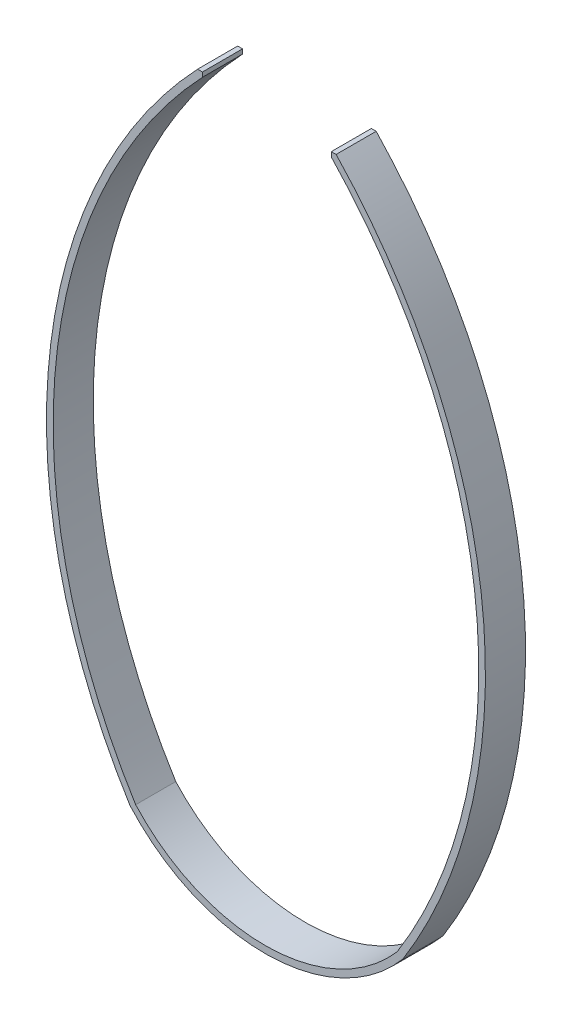
ISO-10303-21;
HEADER;
FILE_DESCRIPTION(('STEP AP214'),'2;1');
FILE_NAME('part.step','',(''),(''),'','','');
FILE_SCHEMA(('AUTOMOTIVE_DESIGN { 1 0 10303 214 1 1 1 1 }'));
ENDSEC;
DATA;
#1=APPLICATION_CONTEXT('core data for automotive mechanical design processes');
#2=APPLICATION_PROTOCOL_DEFINITION('international standard','automotive_design',2000,#1);
#3=PRODUCT_CONTEXT('',#1,'mechanical');
#4=PRODUCT('Part','Part','',(#3));
#5=PRODUCT_RELATED_PRODUCT_CATEGORY('part','',(#4));
#6=PRODUCT_DEFINITION_FORMATION('','',#4);
#7=PRODUCT_DEFINITION_CONTEXT('part definition',#1,'design');
#8=PRODUCT_DEFINITION('design','',#6,#7);
#9=PRODUCT_DEFINITION_SHAPE('','',#8);
#10=(LENGTH_UNIT() NAMED_UNIT(*) SI_UNIT(.MILLI.,.METRE.));
#11=(NAMED_UNIT(*) PLANE_ANGLE_UNIT() SI_UNIT($,.RADIAN.));
#12=(NAMED_UNIT(*) SI_UNIT($,.STERADIAN.) SOLID_ANGLE_UNIT());
#13=UNCERTAINTY_MEASURE_WITH_UNIT(LENGTH_MEASURE(1.E-05),#10,'distance_accuracy_value','');
#14=(GEOMETRIC_REPRESENTATION_CONTEXT(3) GLOBAL_UNCERTAINTY_ASSIGNED_CONTEXT((#13)) GLOBAL_UNIT_ASSIGNED_CONTEXT((#10,
#11,#12)) REPRESENTATION_CONTEXT('',''));
#15=CARTESIAN_POINT('',(0.,0.,0.));
#16=DIRECTION('',(0.,0.,1.));
#17=DIRECTION('',(1.,0.,0.));
#18=AXIS2_PLACEMENT_3D('',#15,#16,#17);
#19=CARTESIAN_POINT('',(246.446674144298,-17.5416481141906,30.));
#20=DIRECTION('',(0.,0.,-1.));
#21=DIRECTION('',(-1.,0.,0.));
#22=AXIS2_PLACEMENT_3D('',#19,#20,#21);
#23=CYLINDRICAL_SURFACE('',#22,408.152597482602);
#24=CARTESIAN_POINT('',(246.446674144298,-17.5416481141906,0.));
#25=DIRECTION('',(0.,0.,-1.));
#26=DIRECTION('',(1.,0.,0.));
#27=AXIS2_PLACEMENT_3D('',#24,#25,#26);
#28=CIRCLE('',#27,408.152597482602);
#29=CARTESIAN_POINT('',(-99.9773100852347,-233.363254961909,0.));
#30=VERTEX_POINT('',#29);
#31=CARTESIAN_POINT('',(-50.,263.007656323691,0.));
#32=VERTEX_POINT('',#31);
#33=EDGE_CURVE('E141',#30,#32,#28,.T.);
#34=ORIENTED_EDGE('',*,*,#33,.T.);
#35=DIRECTION('',(0.,0.,-1.));
#36=VECTOR('',#35,1.);
#37=CARTESIAN_POINT('',(-50.,263.007656323691,30.));
#38=LINE('',#37,#36);
#39=CARTESIAN_POINT('',(-50.,263.007656323691,30.));
#40=VERTEX_POINT('',#39);
#41=EDGE_CURVE('E11',#40,#32,#38,.T.);
#42=ORIENTED_EDGE('',*,*,#41,.F.);
#43=CARTESIAN_POINT('',(246.446674144298,-17.5416481141906,30.));
#44=DIRECTION('',(0.,0.,-1.));
#45=DIRECTION('',(1.,0.,0.));
#46=AXIS2_PLACEMENT_3D('',#43,#44,#45);
#47=CIRCLE('',#46,408.152597482602);
#48=CARTESIAN_POINT('',(-99.9773100852347,-233.363254961909,30.));
#49=VERTEX_POINT('',#48);
#50=EDGE_CURVE('E159',#49,#40,#47,.T.);
#51=ORIENTED_EDGE('',*,*,#50,.F.);
#52=DIRECTION('',(0.,0.,-1.));
#53=VECTOR('',#52,1.);
#54=CARTESIAN_POINT('',(-99.9773100852347,-233.363254961909,30.));
#55=LINE('',#54,#53);
#56=EDGE_CURVE('E137',#49,#30,#55,.T.);
#57=ORIENTED_EDGE('',*,*,#56,.T.);
#58=EDGE_LOOP('',(#34,#42,#51,#57));
#59=FACE_BOUND('',#58,.T.);
#60=ADVANCED_FACE('F33',(#59),#23,.F.);
#61=CARTESIAN_POINT('',(-50.,266.444475128327,30.));
#62=DIRECTION('',(-1.,0.,0.));
#63=DIRECTION('',(0.,0.,1.));
#64=AXIS2_PLACEMENT_3D('',#61,#62,#63);
#65=PLANE('',#64);
#66=DIRECTION('',(0.,1.,0.));
#67=VECTOR('',#66,1.);
#68=CARTESIAN_POINT('',(-50.,266.444475128327,0.));
#69=LINE('',#68,#67);
#70=CARTESIAN_POINT('',(-50.,266.444475128327,0.));
#71=VERTEX_POINT('',#70);
#72=EDGE_CURVE('E144',#32,#71,#69,.T.);
#73=ORIENTED_EDGE('',*,*,#72,.T.);
#74=DIRECTION('',(0.,0.,-1.));
#75=VECTOR('',#74,1.);
#76=CARTESIAN_POINT('',(-50.,266.444475128327,30.));
#77=LINE('',#76,#75);
#78=CARTESIAN_POINT('',(-50.,266.444475128327,30.));
#79=VERTEX_POINT('',#78);
#80=EDGE_CURVE('E41',#79,#71,#77,.T.);
#81=ORIENTED_EDGE('',*,*,#80,.F.);
#82=DIRECTION('',(0.,1.,0.));
#83=VECTOR('',#82,1.);
#84=CARTESIAN_POINT('',(-50.,266.444475128327,30.));
#85=LINE('',#84,#83);
#86=EDGE_CURVE('E98',#40,#79,#85,.T.);
#87=ORIENTED_EDGE('',*,*,#86,.F.);
#88=ORIENTED_EDGE('',*,*,#41,.T.);
#89=EDGE_LOOP('',(#73,#81,#87,#88));
#90=FACE_BOUND('',#89,.T.);
#91=ADVANCED_FACE('F208',(#90),#65,.F.);
#92=CARTESIAN_POINT('',(-53.6315666735031,266.444475128327,30.));
#93=DIRECTION('',(0.,-1.,0.));
#94=DIRECTION('',(0.,0.,-1.));
#95=AXIS2_PLACEMENT_3D('',#92,#93,#94);
#96=PLANE('',#95);
#97=DIRECTION('',(-1.,0.,0.));
#98=VECTOR('',#97,1.);
#99=CARTESIAN_POINT('',(-53.6315666735031,266.444475128327,0.));
#100=LINE('',#99,#98);
#101=CARTESIAN_POINT('',(-53.6315666735031,266.444475128327,0.));
#102=VERTEX_POINT('',#101);
#103=EDGE_CURVE('E146',#71,#102,#100,.T.);
#104=ORIENTED_EDGE('',*,*,#103,.T.);
#105=DIRECTION('',(0.,0.,-1.));
#106=VECTOR('',#105,1.);
#107=CARTESIAN_POINT('',(-53.6315666735031,266.444475128327,30.));
#108=LINE('',#107,#106);
#109=CARTESIAN_POINT('',(-53.6315666735031,266.444475128327,30.));
#110=VERTEX_POINT('',#109);
#111=EDGE_CURVE('E172',#110,#102,#108,.T.);
#112=ORIENTED_EDGE('',*,*,#111,.F.);
#113=DIRECTION('',(-1.,0.,0.));
#114=VECTOR('',#113,1.);
#115=CARTESIAN_POINT('',(-53.6315666735031,266.444475128327,30.));
#116=LINE('',#115,#114);
#117=EDGE_CURVE('E180',#79,#110,#116,.T.);
#118=ORIENTED_EDGE('',*,*,#117,.F.);
#119=ORIENTED_EDGE('',*,*,#80,.T.);
#120=EDGE_LOOP('',(#104,#112,#118,#119));
#121=FACE_BOUND('',#120,.T.);
#122=ADVANCED_FACE('F178',(#121),#96,.F.);
#123=CARTESIAN_POINT('',(246.446674144298,-17.5416481141906,30.));
#124=DIRECTION('',(0.,0.,-1.));
#125=DIRECTION('',(-1.,0.,0.));
#126=AXIS2_PLACEMENT_3D('',#123,#124,#125);
#127=CYLINDRICAL_SURFACE('',#126,413.152597482602);
#128=CARTESIAN_POINT('',(246.446674144298,-17.5416481141906,0.));
#129=DIRECTION('',(0.,0.,1.));
#130=DIRECTION('',(1.,0.,0.));
#131=AXIS2_PLACEMENT_3D('',#128,#129,#130);
#132=CIRCLE('',#131,413.152597482602);
#133=CARTESIAN_POINT('',(-104.221114808838,-236.007138746783,0.));
#134=VERTEX_POINT('',#133);
#135=EDGE_CURVE('E148',#102,#134,#132,.T.);
#136=ORIENTED_EDGE('',*,*,#135,.T.);
#137=DIRECTION('',(0.,0.,-1.));
#138=VECTOR('',#137,1.);
#139=CARTESIAN_POINT('',(-104.221114808838,-236.007138746783,30.));
#140=LINE('',#139,#138);
#141=CARTESIAN_POINT('',(-104.221114808838,-236.007138746783,30.));
#142=VERTEX_POINT('',#141);
#143=EDGE_CURVE('E169',#142,#134,#140,.T.);
#144=ORIENTED_EDGE('',*,*,#143,.F.);
#145=CARTESIAN_POINT('',(246.446674144298,-17.5416481141906,30.));
#146=DIRECTION('',(0.,0.,1.));
#147=DIRECTION('',(1.,0.,0.));
#148=AXIS2_PLACEMENT_3D('',#145,#146,#147);
#149=CIRCLE('',#148,413.152597482602);
#150=EDGE_CURVE('E198',#110,#142,#149,.T.);
#151=ORIENTED_EDGE('',*,*,#150,.F.);
#152=ORIENTED_EDGE('',*,*,#111,.T.);
#153=EDGE_LOOP('',(#136,#144,#151,#152));
#154=FACE_BOUND('',#153,.T.);
#155=ADVANCED_FACE('F189',(#154),#127,.T.);
#156=CARTESIAN_POINT('',(-3.26554658618699,-146.356674021873,30.));
#157=DIRECTION('',(0.,0.,-1.));
#158=DIRECTION('',(-1.,0.,0.));
#159=AXIS2_PLACEMENT_3D('',#156,#157,#158);
#160=CYLINDRICAL_SURFACE('',#159,135.015675314205);
#161=CARTESIAN_POINT('',(-3.26554658618699,-146.356674021873,0.));
#162=DIRECTION('',(0.,0.,1.));
#163=DIRECTION('',(-1.,0.,0.));
#164=AXIS2_PLACEMENT_3D('',#161,#162,#163);
#165=CIRCLE('',#164,135.015675314205);
#166=CARTESIAN_POINT('',(99.9773100852347,-233.363254961909,0.));
#167=VERTEX_POINT('',#166);
#168=EDGE_CURVE('E150',#134,#167,#165,.T.);
#169=ORIENTED_EDGE('',*,*,#168,.T.);
#170=DIRECTION('',(0.,0.,-1.));
#171=VECTOR('',#170,1.);
#172=CARTESIAN_POINT('',(99.9773100852347,-233.363254961909,30.));
#173=LINE('',#172,#171);
#174=CARTESIAN_POINT('',(99.9773100852347,-233.363254961909,30.));
#175=VERTEX_POINT('',#174);
#176=EDGE_CURVE('E166',#175,#167,#173,.T.);
#177=ORIENTED_EDGE('',*,*,#176,.F.);
#178=CARTESIAN_POINT('',(-3.26554658618699,-146.356674021873,30.));
#179=DIRECTION('',(0.,0.,1.));
#180=DIRECTION('',(-1.,0.,0.));
#181=AXIS2_PLACEMENT_3D('',#178,#179,#180);
#182=CIRCLE('',#181,135.015675314205);
#183=EDGE_CURVE('E195',#142,#175,#182,.T.);
#184=ORIENTED_EDGE('',*,*,#183,.F.);
#185=ORIENTED_EDGE('',*,*,#143,.T.);
#186=EDGE_LOOP('',(#169,#177,#184,#185));
#187=FACE_BOUND('',#186,.T.);
#188=ADVANCED_FACE('F193',(#187),#160,.T.);
#189=CARTESIAN_POINT('',(-246.446674144298,-17.5416481141906,30.));
#190=DIRECTION('',(0.,0.,-1.));
#191=DIRECTION('',(-1.,0.,0.));
#192=AXIS2_PLACEMENT_3D('',#189,#190,#191);
#193=CYLINDRICAL_SURFACE('',#192,408.152597482602);
#194=CARTESIAN_POINT('',(-246.446674144298,-17.5416481141906,0.));
#195=DIRECTION('',(0.,0.,1.));
#196=DIRECTION('',(-1.,0.,0.));
#197=AXIS2_PLACEMENT_3D('',#194,#195,#196);
#198=CIRCLE('',#197,408.152597482602);
#199=CARTESIAN_POINT('',(50.,263.007656323691,0.));
#200=VERTEX_POINT('',#199);
#201=EDGE_CURVE('E152',#167,#200,#198,.T.);
#202=ORIENTED_EDGE('',*,*,#201,.T.);
#203=DIRECTION('',(0.,0.,-1.));
#204=VECTOR('',#203,1.);
#205=CARTESIAN_POINT('',(50.,263.007656323691,30.));
#206=LINE('',#205,#204);
#207=CARTESIAN_POINT('',(50.,263.007656323691,30.));
#208=VERTEX_POINT('',#207);
#209=EDGE_CURVE('E163',#208,#200,#206,.T.);
#210=ORIENTED_EDGE('',*,*,#209,.F.);
#211=CARTESIAN_POINT('',(-246.446674144298,-17.5416481141906,30.));
#212=DIRECTION('',(0.,0.,1.));
#213=DIRECTION('',(-1.,0.,0.));
#214=AXIS2_PLACEMENT_3D('',#211,#212,#213);
#215=CIRCLE('',#214,408.152597482602);
#216=EDGE_CURVE('E197',#175,#208,#215,.T.);
#217=ORIENTED_EDGE('',*,*,#216,.F.);
#218=ORIENTED_EDGE('',*,*,#176,.T.);
#219=EDGE_LOOP('',(#202,#210,#217,#218));
#220=FACE_BOUND('',#219,.T.);
#221=ADVANCED_FACE('F220',(#220),#193,.T.);
#222=CARTESIAN_POINT('',(46.3684333264971,263.007656323691,30.));
#223=DIRECTION('',(0.,-1.,0.));
#224=DIRECTION('',(0.,0.,-1.));
#225=AXIS2_PLACEMENT_3D('',#222,#223,#224);
#226=PLANE('',#225);
#227=DIRECTION('',(-1.,0.,0.));
#228=VECTOR('',#227,1.);
#229=CARTESIAN_POINT('',(46.3684333264971,263.007656323691,0.));
#230=LINE('',#229,#228);
#231=CARTESIAN_POINT('',(46.3684333264971,263.007656323691,0.));
#232=VERTEX_POINT('',#231);
#233=EDGE_CURVE('E154',#200,#232,#230,.T.);
#234=ORIENTED_EDGE('',*,*,#233,.T.);
#235=DIRECTION('',(0.,0.,-1.));
#236=VECTOR('',#235,1.);
#237=CARTESIAN_POINT('',(46.3684333264971,263.007656323691,30.));
#238=LINE('',#237,#236);
#239=CARTESIAN_POINT('',(46.3684333264971,263.007656323691,30.));
#240=VERTEX_POINT('',#239);
#241=EDGE_CURVE('E132',#240,#232,#238,.T.);
#242=ORIENTED_EDGE('',*,*,#241,.F.);
#243=DIRECTION('',(-1.,0.,0.));
#244=VECTOR('',#243,1.);
#245=CARTESIAN_POINT('',(46.3684333264971,263.007656323691,30.));
#246=LINE('',#245,#244);
#247=EDGE_CURVE('E123',#208,#240,#246,.T.);
#248=ORIENTED_EDGE('',*,*,#247,.F.);
#249=ORIENTED_EDGE('',*,*,#209,.T.);
#250=EDGE_LOOP('',(#234,#242,#248,#249));
#251=FACE_BOUND('',#250,.T.);
#252=ADVANCED_FACE('F223',(#251),#226,.F.);
#253=CARTESIAN_POINT('',(46.3684333264971,259.570837519054,30.));
#254=DIRECTION('',(1.,0.,0.));
#255=DIRECTION('',(0.,0.,-1.));
#256=AXIS2_PLACEMENT_3D('',#253,#254,#255);
#257=PLANE('',#256);
#258=DIRECTION('',(0.,-1.,0.));
#259=VECTOR('',#258,1.);
#260=CARTESIAN_POINT('',(46.3684333264971,259.570837519054,0.));
#261=LINE('',#260,#259);
#262=CARTESIAN_POINT('',(46.3684333264971,259.570837519054,0.));
#263=VERTEX_POINT('',#262);
#264=EDGE_CURVE('E131',#232,#263,#261,.T.);
#265=ORIENTED_EDGE('',*,*,#264,.T.);
#266=DIRECTION('',(0.,0.,-1.));
#267=VECTOR('',#266,1.);
#268=CARTESIAN_POINT('',(46.3684333264971,259.570837519054,30.));
#269=LINE('',#268,#267);
#270=CARTESIAN_POINT('',(46.3684333264971,259.570837519054,30.));
#271=VERTEX_POINT('',#270);
#272=EDGE_CURVE('E128',#271,#263,#269,.T.);
#273=ORIENTED_EDGE('',*,*,#272,.F.);
#274=DIRECTION('',(0.,-1.,0.));
#275=VECTOR('',#274,1.);
#276=CARTESIAN_POINT('',(46.3684333264971,259.570837519054,30.));
#277=LINE('',#276,#275);
#278=EDGE_CURVE('E117',#240,#271,#277,.T.);
#279=ORIENTED_EDGE('',*,*,#278,.F.);
#280=ORIENTED_EDGE('',*,*,#241,.T.);
#281=EDGE_LOOP('',(#265,#273,#279,#280));
#282=FACE_BOUND('',#281,.T.);
#283=ADVANCED_FACE('F129',(#282),#257,.F.);
#284=CARTESIAN_POINT('',(-246.446674144298,-17.5416481141906,30.));
#285=DIRECTION('',(0.,0.,-1.));
#286=DIRECTION('',(-1.,0.,0.));
#287=AXIS2_PLACEMENT_3D('',#284,#285,#286);
#288=CYLINDRICAL_SURFACE('',#287,403.152597482602);
#289=CARTESIAN_POINT('',(-246.446674144298,-17.5416481141906,0.));
#290=DIRECTION('',(0.,0.,-1.));
#291=DIRECTION('',(-1.,0.,0.));
#292=AXIS2_PLACEMENT_3D('',#289,#290,#291);
#293=CIRCLE('',#292,403.152597482602);
#294=CARTESIAN_POINT('',(95.7335053616312,-230.719371177035,0.));
#295=VERTEX_POINT('',#294);
#296=EDGE_CURVE('E84',#263,#295,#293,.T.);
#297=ORIENTED_EDGE('',*,*,#296,.T.);
#298=DIRECTION('',(0.,0.,-1.));
#299=VECTOR('',#298,1.);
#300=CARTESIAN_POINT('',(95.7335053616312,-230.719371177035,30.));
#301=LINE('',#300,#299);
#302=CARTESIAN_POINT('',(95.7335053616312,-230.719371177035,30.));
#303=VERTEX_POINT('',#302);
#304=EDGE_CURVE('E133',#303,#295,#301,.T.);
#305=ORIENTED_EDGE('',*,*,#304,.F.);
#306=CARTESIAN_POINT('',(-246.446674144298,-17.5416481141906,30.));
#307=DIRECTION('',(0.,0.,-1.));
#308=DIRECTION('',(-1.,0.,0.));
#309=AXIS2_PLACEMENT_3D('',#306,#307,#308);
#310=CIRCLE('',#309,403.152597482602);
#311=EDGE_CURVE('E121',#271,#303,#310,.T.);
#312=ORIENTED_EDGE('',*,*,#311,.F.);
#313=ORIENTED_EDGE('',*,*,#272,.T.);
#314=EDGE_LOOP('',(#297,#305,#312,#313));
#315=FACE_BOUND('',#314,.T.);
#316=ADVANCED_FACE('F135',(#315),#288,.F.);
#317=CARTESIAN_POINT('',(-3.29121983458323,-145.483773201959,30.));
#318=DIRECTION('',(0.,0.,-1.));
#319=DIRECTION('',(-1.,0.,0.));
#320=AXIS2_PLACEMENT_3D('',#317,#318,#319);
#321=CYLINDRICAL_SURFACE('',#320,130.656049849804);
#322=CARTESIAN_POINT('',(-3.29121983458323,-145.483773201959,0.));
#323=DIRECTION('',(0.,0.,-1.));
#324=DIRECTION('',(1.,0.,0.));
#325=AXIS2_PLACEMENT_3D('',#322,#323,#324);
#326=CIRCLE('',#325,130.656049849804);
#327=EDGE_CURVE('E90',#295,#30,#326,.T.);
#328=ORIENTED_EDGE('',*,*,#327,.T.);
#329=ORIENTED_EDGE('',*,*,#56,.F.);
#330=CARTESIAN_POINT('',(-3.29121983458323,-145.483773201959,30.));
#331=DIRECTION('',(0.,0.,-1.));
#332=DIRECTION('',(1.,0.,0.));
#333=AXIS2_PLACEMENT_3D('',#330,#331,#332);
#334=CIRCLE('',#333,130.656049849804);
#335=EDGE_CURVE('E49',#303,#49,#334,.T.);
#336=ORIENTED_EDGE('',*,*,#335,.F.);
#337=ORIENTED_EDGE('',*,*,#304,.T.);
#338=EDGE_LOOP('',(#328,#329,#336,#337));
#339=FACE_BOUND('',#338,.T.);
#340=ADVANCED_FACE('F232',(#339),#321,.F.);
#341=CARTESIAN_POINT('',(246.446674144298,-17.5416481141906,30.));
#342=DIRECTION('',(0.,0.,1.));
#343=DIRECTION('',(1.,0.,0.));
#344=AXIS2_PLACEMENT_3D('',#341,#342,#343);
#345=PLANE('',#344);
#346=ORIENTED_EDGE('',*,*,#50,.T.);
#347=ORIENTED_EDGE('',*,*,#86,.T.);
#348=ORIENTED_EDGE('',*,*,#117,.T.);
#349=ORIENTED_EDGE('',*,*,#150,.T.);
#350=ORIENTED_EDGE('',*,*,#183,.T.);
#351=ORIENTED_EDGE('',*,*,#216,.T.);
#352=ORIENTED_EDGE('',*,*,#247,.T.);
#353=ORIENTED_EDGE('',*,*,#278,.T.);
#354=ORIENTED_EDGE('',*,*,#311,.T.);
#355=ORIENTED_EDGE('',*,*,#335,.T.);
#356=EDGE_LOOP('',(#346,#347,#348,#349,#350,#351,#352,#353,#354,#355));
#357=FACE_BOUND('',#356,.T.);
#358=ADVANCED_FACE('F119',(#357),#345,.T.);
#359=CARTESIAN_POINT('',(246.446674144298,-17.5416481141906,0.));
#360=DIRECTION('',(0.,0.,1.));
#361=DIRECTION('',(1.,0.,0.));
#362=AXIS2_PLACEMENT_3D('',#359,#360,#361);
#363=PLANE('',#362);
#364=ORIENTED_EDGE('',*,*,#33,.F.);
#365=ORIENTED_EDGE('',*,*,#327,.F.);
#366=ORIENTED_EDGE('',*,*,#296,.F.);
#367=ORIENTED_EDGE('',*,*,#264,.F.);
#368=ORIENTED_EDGE('',*,*,#233,.F.);
#369=ORIENTED_EDGE('',*,*,#201,.F.);
#370=ORIENTED_EDGE('',*,*,#168,.F.);
#371=ORIENTED_EDGE('',*,*,#135,.F.);
#372=ORIENTED_EDGE('',*,*,#103,.F.);
#373=ORIENTED_EDGE('',*,*,#72,.F.);
#374=EDGE_LOOP('',(#364,#365,#366,#367,#368,#369,#370,#371,#372,#373));
#375=FACE_BOUND('',#374,.T.);
#376=ADVANCED_FACE('F184',(#375),#363,.F.);
#377=CLOSED_SHELL('',(#60,#91,#122,#155,#188,#221,#252,#283,#316,#340,#358,#376));
#378=MANIFOLD_SOLID_BREP('B2',#377);
#379=ADVANCED_BREP_SHAPE_REPRESENTATION('',(#18,#378),#14);
#380=SHAPE_DEFINITION_REPRESENTATION(#9,#379);
ENDSEC;
END-ISO-10303-21;
